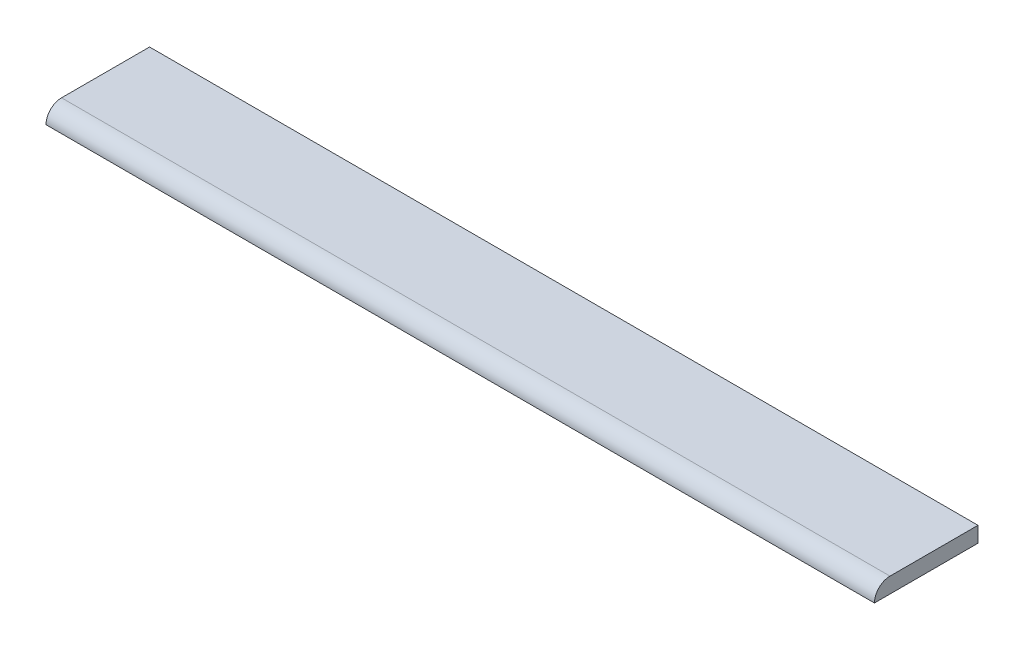
ISO-10303-21;
HEADER;
FILE_DESCRIPTION(('STEP AP214'),'2;1');
FILE_NAME('part.step','',(''),(''),'','','');
FILE_SCHEMA(('AUTOMOTIVE_DESIGN { 1 0 10303 214 1 1 1 1 }'));
ENDSEC;
DATA;
#1=APPLICATION_CONTEXT('core data for automotive mechanical design processes');
#2=APPLICATION_PROTOCOL_DEFINITION('international standard','automotive_design',2000,#1);
#3=PRODUCT_CONTEXT('',#1,'mechanical');
#4=PRODUCT('Part','Part','',(#3));
#5=PRODUCT_RELATED_PRODUCT_CATEGORY('part','',(#4));
#6=PRODUCT_DEFINITION_FORMATION('','',#4);
#7=PRODUCT_DEFINITION_CONTEXT('part definition',#1,'design');
#8=PRODUCT_DEFINITION('design','',#6,#7);
#9=PRODUCT_DEFINITION_SHAPE('','',#8);
#10=(LENGTH_UNIT() NAMED_UNIT(*) SI_UNIT(.MILLI.,.METRE.));
#11=(NAMED_UNIT(*) PLANE_ANGLE_UNIT() SI_UNIT($,.RADIAN.));
#12=(NAMED_UNIT(*) SI_UNIT($,.STERADIAN.) SOLID_ANGLE_UNIT());
#13=UNCERTAINTY_MEASURE_WITH_UNIT(LENGTH_MEASURE(1.E-05),#10,'distance_accuracy_value','');
#14=(GEOMETRIC_REPRESENTATION_CONTEXT(3) GLOBAL_UNCERTAINTY_ASSIGNED_CONTEXT((#13)) GLOBAL_UNIT_ASSIGNED_CONTEXT((#10,
#11,#12)) REPRESENTATION_CONTEXT('',''));
#15=CARTESIAN_POINT('',(0.,0.,0.));
#16=DIRECTION('',(0.,0.,1.));
#17=DIRECTION('',(1.,0.,0.));
#18=AXIS2_PLACEMENT_3D('',#15,#16,#17);
#19=CARTESIAN_POINT('',(-38.2642142969159,3.,-6.96256038647343));
#20=DIRECTION('',(1.,0.,0.));
#21=DIRECTION('',(0.,0.,-1.));
#22=AXIS2_PLACEMENT_3D('',#19,#20,#21);
#23=PLANE('',#22);
#24=DIRECTION('',(0.,0.,1.));
#25=VECTOR('',#24,1.);
#26=CARTESIAN_POINT('',(-38.2642142969159,0.,-6.96256038647343));
#27=LINE('',#26,#25);
#28=CARTESIAN_POINT('',(-38.2642142969159,0.,-6.96256038647343));
#29=VERTEX_POINT('',#28);
#30=CARTESIAN_POINT('',(-38.2642142969159,0.,13.0374396135266));
#31=VERTEX_POINT('',#30);
#32=EDGE_CURVE('E108',#29,#31,#27,.T.);
#33=ORIENTED_EDGE('',*,*,#32,.T.);
#34=CARTESIAN_POINT('',(-38.2642142969159,0.,10.0374396135266));
#35=DIRECTION('',(1.,0.,0.));
#36=DIRECTION('',(0.,0.,-1.));
#37=AXIS2_PLACEMENT_3D('',#34,#35,#36);
#38=CIRCLE('',#37,3.);
#39=CARTESIAN_POINT('',(-38.2642142969159,3.,10.0374396135266));
#40=VERTEX_POINT('',#39);
#41=EDGE_CURVE('E11',#31,#40,#38,.F.);
#42=ORIENTED_EDGE('',*,*,#41,.T.);
#43=DIRECTION('',(0.,0.,1.));
#44=VECTOR('',#43,1.);
#45=CARTESIAN_POINT('',(-38.2642142969159,3.,-6.96256038647343));
#46=LINE('',#45,#44);
#47=CARTESIAN_POINT('',(-38.2642142969159,3.,-6.96256038647343));
#48=VERTEX_POINT('',#47);
#49=EDGE_CURVE('E91',#48,#40,#46,.T.);
#50=ORIENTED_EDGE('',*,*,#49,.F.);
#51=DIRECTION('',(0.,-1.,0.));
#52=VECTOR('',#51,1.);
#53=CARTESIAN_POINT('',(-38.2642142969159,3.,-6.96256038647343));
#54=LINE('',#53,#52);
#55=EDGE_CURVE('E100',#48,#29,#54,.T.);
#56=ORIENTED_EDGE('',*,*,#55,.T.);
#57=EDGE_LOOP('',(#33,#42,#50,#56));
#58=FACE_BOUND('',#57,.T.);
#59=ADVANCED_FACE('F43',(#58),#23,.F.);
#60=CARTESIAN_POINT('',(121.735785703084,3.,-6.96256038647343));
#61=DIRECTION('',(-1.,0.,0.));
#62=DIRECTION('',(0.,0.,1.));
#63=AXIS2_PLACEMENT_3D('',#60,#61,#62);
#64=PLANE('',#63);
#65=DIRECTION('',(0.,0.,-1.));
#66=VECTOR('',#65,1.);
#67=CARTESIAN_POINT('',(121.735785703084,3.,-6.96256038647343));
#68=LINE('',#67,#66);
#69=CARTESIAN_POINT('',(121.735785703084,3.,10.0374396135266));
#70=VERTEX_POINT('',#69);
#71=CARTESIAN_POINT('',(121.735785703084,3.,-6.96256038647343));
#72=VERTEX_POINT('',#71);
#73=EDGE_CURVE('E83',#70,#72,#68,.T.);
#74=ORIENTED_EDGE('',*,*,#73,.F.);
#75=CARTESIAN_POINT('',(121.735785703084,0.,10.0374396135266));
#76=DIRECTION('',(-1.,0.,0.));
#77=DIRECTION('',(0.,0.,1.));
#78=AXIS2_PLACEMENT_3D('',#75,#76,#77);
#79=CIRCLE('',#78,3.);
#80=CARTESIAN_POINT('',(121.735785703084,0.,13.0374396135266));
#81=VERTEX_POINT('',#80);
#82=EDGE_CURVE('E51',#70,#81,#79,.F.);
#83=ORIENTED_EDGE('',*,*,#82,.T.);
#84=DIRECTION('',(0.,0.,-1.));
#85=VECTOR('',#84,1.);
#86=CARTESIAN_POINT('',(121.735785703084,0.,-6.96256038647343));
#87=LINE('',#86,#85);
#88=CARTESIAN_POINT('',(121.735785703084,0.,-6.96256038647343));
#89=VERTEX_POINT('',#88);
#90=EDGE_CURVE('E97',#81,#89,#87,.T.);
#91=ORIENTED_EDGE('',*,*,#90,.T.);
#92=DIRECTION('',(0.,-1.,0.));
#93=VECTOR('',#92,1.);
#94=CARTESIAN_POINT('',(121.735785703084,3.,-6.96256038647343));
#95=LINE('',#94,#93);
#96=EDGE_CURVE('E94',#72,#89,#95,.T.);
#97=ORIENTED_EDGE('',*,*,#96,.F.);
#98=EDGE_LOOP('',(#74,#83,#91,#97));
#99=FACE_BOUND('',#98,.T.);
#100=ADVANCED_FACE('F95',(#99),#64,.F.);
#101=CARTESIAN_POINT('',(-38.2642142969159,3.,-6.96256038647343));
#102=DIRECTION('',(0.,0.,1.));
#103=DIRECTION('',(1.,0.,0.));
#104=AXIS2_PLACEMENT_3D('',#101,#102,#103);
#105=PLANE('',#104);
#106=DIRECTION('',(-1.,0.,0.));
#107=VECTOR('',#106,1.);
#108=CARTESIAN_POINT('',(-38.2642142969159,0.,-6.96256038647343));
#109=LINE('',#108,#107);
#110=EDGE_CURVE('E113',#89,#29,#109,.T.);
#111=ORIENTED_EDGE('',*,*,#110,.T.);
#112=ORIENTED_EDGE('',*,*,#55,.F.);
#113=DIRECTION('',(-1.,0.,0.));
#114=VECTOR('',#113,1.);
#115=CARTESIAN_POINT('',(-38.2642142969159,3.,-6.96256038647343));
#116=LINE('',#115,#114);
#117=EDGE_CURVE('E87',#72,#48,#116,.T.);
#118=ORIENTED_EDGE('',*,*,#117,.F.);
#119=ORIENTED_EDGE('',*,*,#96,.T.);
#120=EDGE_LOOP('',(#111,#112,#118,#119));
#121=FACE_BOUND('',#120,.T.);
#122=ADVANCED_FACE('F102',(#121),#105,.F.);
#123=CARTESIAN_POINT('',(0.,3.,0.));
#124=DIRECTION('',(0.,1.,0.));
#125=DIRECTION('',(0.,0.,1.));
#126=AXIS2_PLACEMENT_3D('',#123,#124,#125);
#127=PLANE('',#126);
#128=ORIENTED_EDGE('',*,*,#49,.T.);
#129=DIRECTION('',(1.,0.,0.));
#130=VECTOR('',#129,1.);
#131=CARTESIAN_POINT('',(121.735785703084,3.,10.0374396135266));
#132=LINE('',#131,#130);
#133=EDGE_CURVE('E89',#40,#70,#132,.T.);
#134=ORIENTED_EDGE('',*,*,#133,.T.);
#135=ORIENTED_EDGE('',*,*,#73,.T.);
#136=ORIENTED_EDGE('',*,*,#117,.T.);
#137=EDGE_LOOP('',(#128,#134,#135,#136));
#138=FACE_BOUND('',#137,.T.);
#139=ADVANCED_FACE('F85',(#138),#127,.T.);
#140=CARTESIAN_POINT('',(0.,0.,0.));
#141=DIRECTION('',(0.,1.,0.));
#142=DIRECTION('',(0.,0.,1.));
#143=AXIS2_PLACEMENT_3D('',#140,#141,#142);
#144=PLANE('',#143);
#145=ORIENTED_EDGE('',*,*,#32,.F.);
#146=ORIENTED_EDGE('',*,*,#110,.F.);
#147=ORIENTED_EDGE('',*,*,#90,.F.);
#148=DIRECTION('',(1.,0.,0.));
#149=VECTOR('',#148,1.);
#150=CARTESIAN_POINT('',(-38.2642142969159,0.,13.0374396135266));
#151=LINE('',#150,#149);
#152=EDGE_CURVE('E110',#31,#81,#151,.T.);
#153=ORIENTED_EDGE('',*,*,#152,.F.);
#154=EDGE_LOOP('',(#145,#146,#147,#153));
#155=FACE_BOUND('',#154,.T.);
#156=ADVANCED_FACE('F117',(#155),#144,.F.);
#157=CARTESIAN_POINT('',(0.,0.,10.0374396135266));
#158=DIRECTION('',(-1.,0.,0.));
#159=DIRECTION('',(0.,0.,1.));
#160=AXIS2_PLACEMENT_3D('',#157,#158,#159);
#161=CYLINDRICAL_SURFACE('',#160,3.);
#162=ORIENTED_EDGE('',*,*,#41,.F.);
#163=ORIENTED_EDGE('',*,*,#152,.T.);
#164=ORIENTED_EDGE('',*,*,#82,.F.);
#165=ORIENTED_EDGE('',*,*,#133,.F.);
#166=EDGE_LOOP('',(#162,#163,#164,#165));
#167=FACE_BOUND('',#166,.T.);
#168=ADVANCED_FACE('F45',(#167),#161,.T.);
#169=CLOSED_SHELL('',(#59,#100,#122,#139,#156,#168));
#170=MANIFOLD_SOLID_BREP('B2',#169);
#171=ADVANCED_BREP_SHAPE_REPRESENTATION('',(#18,#170),#14);
#172=SHAPE_DEFINITION_REPRESENTATION(#9,#171);
ENDSEC;
END-ISO-10303-21;
